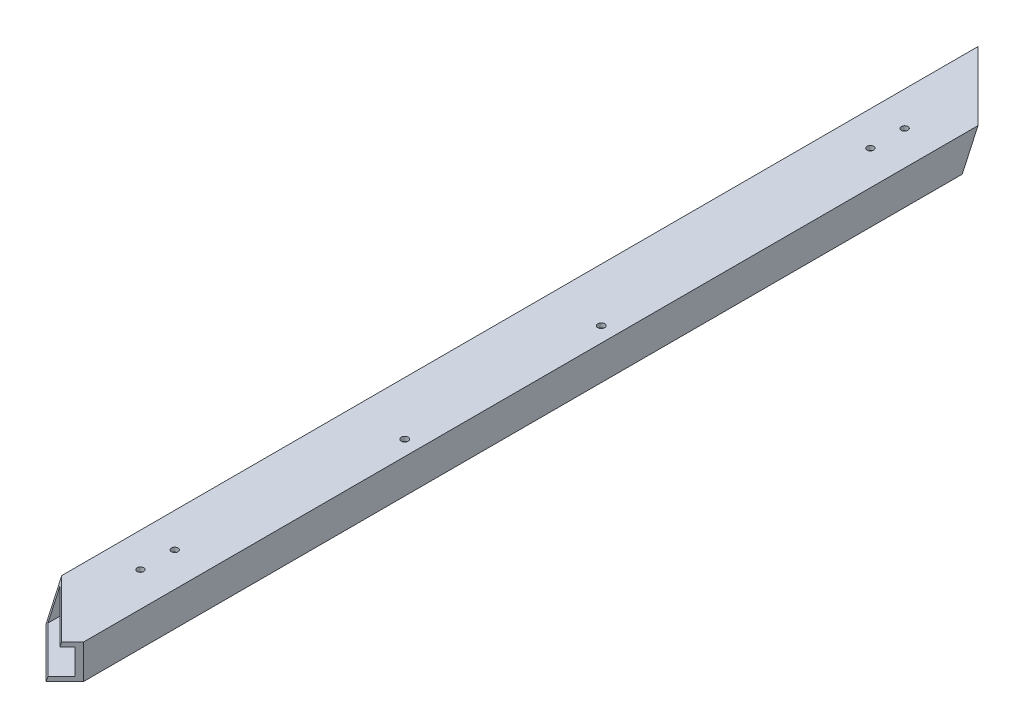
ISO-10303-21;
HEADER;
FILE_DESCRIPTION(('STEP AP214'),'2;1');
FILE_NAME('part.step','',(''),(''),'','','');
FILE_SCHEMA(('AUTOMOTIVE_DESIGN { 1 0 10303 214 1 1 1 1 }'));
ENDSEC;
DATA;
#1=APPLICATION_CONTEXT('core data for automotive mechanical design processes');
#2=APPLICATION_PROTOCOL_DEFINITION('international standard','automotive_design',2000,#1);
#3=PRODUCT_CONTEXT('',#1,'mechanical');
#4=PRODUCT('Part','Part','',(#3));
#5=PRODUCT_RELATED_PRODUCT_CATEGORY('part','',(#4));
#6=PRODUCT_DEFINITION_FORMATION('','',#4);
#7=PRODUCT_DEFINITION_CONTEXT('part definition',#1,'design');
#8=PRODUCT_DEFINITION('design','',#6,#7);
#9=PRODUCT_DEFINITION_SHAPE('','',#8);
#10=(LENGTH_UNIT() NAMED_UNIT(*) SI_UNIT(.MILLI.,.METRE.));
#11=(NAMED_UNIT(*) PLANE_ANGLE_UNIT() SI_UNIT($,.RADIAN.));
#12=(NAMED_UNIT(*) SI_UNIT($,.STERADIAN.) SOLID_ANGLE_UNIT());
#13=UNCERTAINTY_MEASURE_WITH_UNIT(LENGTH_MEASURE(1.E-05),#10,'distance_accuracy_value','');
#14=(GEOMETRIC_REPRESENTATION_CONTEXT(3) GLOBAL_UNCERTAINTY_ASSIGNED_CONTEXT((#13)) GLOBAL_UNIT_ASSIGNED_CONTEXT((#10,
#11,#12)) REPRESENTATION_CONTEXT('',''));
#15=CARTESIAN_POINT('',(0.,0.,0.));
#16=DIRECTION('',(0.,0.,1.));
#17=DIRECTION('',(1.,0.,0.));
#18=AXIS2_PLACEMENT_3D('',#15,#16,#17);
#19=CARTESIAN_POINT('',(25.4,-12.7,771.9314));
#20=DIRECTION('',(-1.,0.,0.));
#21=DIRECTION('',(0.,0.,1.));
#22=AXIS2_PLACEMENT_3D('',#19,#20,#21);
#23=PLANE('',#22);
#24=DIRECTION('',(0.,-0.90866085456603,0.417534970247202));
#25=VECTOR('',#24,1.);
#26=CARTESIAN_POINT('',(25.4,-281.867461744109,186.155469267859));
#27=LINE('',#26,#25);
#28=CARTESIAN_POINT('',(25.3999999999999,12.7,50.7999999999986));
#29=VERTEX_POINT('',#28);
#30=CARTESIAN_POINT('',(25.4,-12.7,62.4714483638043));
#31=VERTEX_POINT('',#30);
#32=EDGE_CURVE('E132',#29,#31,#27,.T.);
#33=ORIENTED_EDGE('',*,*,#32,.F.);
#34=DIRECTION('',(0.,0.,-1.));
#35=VECTOR('',#34,1.);
#36=CARTESIAN_POINT('',(25.4,12.7,771.9314));
#37=LINE('',#36,#35);
#38=CARTESIAN_POINT('',(25.4,12.7,714.375));
#39=VERTEX_POINT('',#38);
#40=EDGE_CURVE('E42',#39,#29,#37,.T.);
#41=ORIENTED_EDGE('',*,*,#40,.F.);
#42=DIRECTION('',(0.,1.,0.));
#43=VECTOR('',#42,1.);
#44=CARTESIAN_POINT('',(25.4,-12.7,714.375));
#45=LINE('',#44,#43);
#46=CARTESIAN_POINT('',(25.4,-12.7,714.375));
#47=VERTEX_POINT('',#46);
#48=EDGE_CURVE('E130',#47,#39,#45,.T.);
#49=ORIENTED_EDGE('',*,*,#48,.F.);
#50=DIRECTION('',(0.,0.,-1.));
#51=VECTOR('',#50,1.);
#52=CARTESIAN_POINT('',(25.4,-12.7,771.9314));
#53=LINE('',#52,#51);
#54=EDGE_CURVE('E159',#47,#31,#53,.T.);
#55=ORIENTED_EDGE('',*,*,#54,.T.);
#56=EDGE_LOOP('',(#33,#41,#49,#55));
#57=FACE_BOUND('',#56,.T.);
#58=ADVANCED_FACE('F34',(#57),#23,.F.);
#59=CARTESIAN_POINT('',(-25.4,-12.7,771.9314));
#60=DIRECTION('',(1.,0.,0.));
#61=DIRECTION('',(0.,0.,-1.));
#62=AXIS2_PLACEMENT_3D('',#59,#60,#61);
#63=PLANE('',#62);
#64=DIRECTION('',(0.,0.,-1.));
#65=VECTOR('',#64,1.);
#66=CARTESIAN_POINT('',(-25.4,-12.7,771.9314));
#67=LINE('',#66,#65);
#68=CARTESIAN_POINT('',(-25.4,-12.7,691.557478073252));
#69=VERTEX_POINT('',#68);
#70=CARTESIAN_POINT('',(-25.4,-12.7,11.6714483638057));
#71=VERTEX_POINT('',#70);
#72=EDGE_CURVE('E162',#69,#71,#67,.T.);
#73=ORIENTED_EDGE('',*,*,#72,.F.);
#74=DIRECTION('',(0.,0.90866085456603,-0.417534970247202));
#75=VECTOR('',#74,1.);
#76=CARTESIAN_POINT('',(-25.4,-43.1936797426668,705.569502031478));
#77=LINE('',#76,#75);
#78=CARTESIAN_POINT('',(-25.4000000000001,12.7,679.886029709446));
#79=VERTEX_POINT('',#78);
#80=EDGE_CURVE('E179',#69,#79,#77,.T.);
#81=ORIENTED_EDGE('',*,*,#80,.T.);
#82=DIRECTION('',(0.,0.,-1.));
#83=VECTOR('',#82,1.);
#84=CARTESIAN_POINT('',(-25.4,12.7,771.9314));
#85=LINE('',#84,#83);
#86=CARTESIAN_POINT('',(-25.4,12.7,0.));
#87=VERTEX_POINT('',#86);
#88=EDGE_CURVE('E126',#79,#87,#85,.T.);
#89=ORIENTED_EDGE('',*,*,#88,.T.);
#90=DIRECTION('',(0.,0.90866085456603,-0.417534970247202));
#91=VECTOR('',#90,1.);
#92=CARTESIAN_POINT('',(-25.4,-301.14086403421,144.211710197931));
#93=LINE('',#92,#91);
#94=EDGE_CURVE('E136',#71,#87,#93,.T.);
#95=ORIENTED_EDGE('',*,*,#94,.F.);
#96=EDGE_LOOP('',(#73,#81,#89,#95));
#97=FACE_BOUND('',#96,.T.);
#98=ADVANCED_FACE('F194',(#97),#63,.F.);
#99=CARTESIAN_POINT('',(-25.4,-12.7,771.9314));
#100=DIRECTION('',(0.,1.,0.));
#101=DIRECTION('',(0.,0.,1.));
#102=AXIS2_PLACEMENT_3D('',#99,#100,#101);
#103=PLANE('',#102);
#104=CARTESIAN_POINT('',(14.2367000000049,-12.7,319.172239036625));
#105=DIRECTION('',(0.,-1.,0.));
#106=DIRECTION('',(0.,0.,-1.));
#107=AXIS2_PLACEMENT_3D('',#104,#105,#106);
#108=CIRCLE('',#107,2.57975099999999);
#109=CARTESIAN_POINT('',(14.2367000000049,-12.7,316.592488036625));
#110=VERTEX_POINT('',#109);
#111=EDGE_CURVE('E327',#110,#110,#108,.T.);
#112=ORIENTED_EDGE('',*,*,#111,.F.);
#113=EDGE_LOOP('',(#112));
#114=FACE_BOUND('',#113,.T.);
#115=CARTESIAN_POINT('',(14.2367000000001,-12.7,464.968239036626));
#116=DIRECTION('',(0.,-1.,0.));
#117=DIRECTION('',(0.,0.,-1.));
#118=AXIS2_PLACEMENT_3D('',#115,#116,#117);
#119=CIRCLE('',#118,2.57975099999999);
#120=CARTESIAN_POINT('',(14.2367000000001,-12.7,462.388488036626));
#121=VERTEX_POINT('',#120);
#122=EDGE_CURVE('E320',#121,#121,#119,.T.);
#123=ORIENTED_EDGE('',*,*,#122,.F.);
#124=EDGE_LOOP('',(#123));
#125=FACE_BOUND('',#124,.T.);
#126=CARTESIAN_POINT('',(-6.24500451351651E-12,-12.7,621.467704493594));
#127=DIRECTION('',(0.,1.,0.));
#128=DIRECTION('',(0.,0.,1.));
#129=AXIS2_PLACEMENT_3D('',#126,#127,#128);
#130=CIRCLE('',#129,2.4638);
#131=CARTESIAN_POINT('',(-6.24500451351651E-12,-12.7,623.931504493594));
#132=VERTEX_POINT('',#131);
#133=EDGE_CURVE('E307',#132,#132,#130,.T.);
#134=ORIENTED_EDGE('',*,*,#133,.T.);
#135=EDGE_LOOP('',(#134));
#136=FACE_BOUND('',#135,.T.);
#137=CARTESIAN_POINT('',(-6.00561267383171E-12,-12.7,646.867704493594));
#138=DIRECTION('',(0.,1.,0.));
#139=DIRECTION('',(0.,0.,1.));
#140=AXIS2_PLACEMENT_3D('',#137,#138,#139);
#141=CIRCLE('',#140,2.4638);
#142=CARTESIAN_POINT('',(-6.00561267383171E-12,-12.7,649.331504493594));
#143=VERTEX_POINT('',#142);
#144=EDGE_CURVE('E297',#143,#143,#141,.T.);
#145=ORIENTED_EDGE('',*,*,#144,.T.);
#146=EDGE_LOOP('',(#145));
#147=FACE_BOUND('',#146,.T.);
#148=CARTESIAN_POINT('',(-1.99840144432528E-12,-12.7,79.8576765553637));
#149=DIRECTION('',(0.,-1.,0.));
#150=DIRECTION('',(0.,0.,-1.));
#151=AXIS2_PLACEMENT_3D('',#148,#149,#150);
#152=CIRCLE('',#151,2.4638);
#153=CARTESIAN_POINT('',(-1.99840144432528E-12,-12.7,77.3938765553637));
#154=VERTEX_POINT('',#153);
#155=EDGE_CURVE('E288',#154,#154,#152,.T.);
#156=ORIENTED_EDGE('',*,*,#155,.F.);
#157=EDGE_LOOP('',(#156));
#158=FACE_BOUND('',#157,.T.);
#159=CARTESIAN_POINT('',(-1.74166236988071E-12,-12.7,105.257676555364));
#160=DIRECTION('',(0.,-1.,0.));
#161=DIRECTION('',(0.,0.,-1.));
#162=AXIS2_PLACEMENT_3D('',#159,#160,#161);
#163=CIRCLE('',#162,2.4638);
#164=CARTESIAN_POINT('',(-1.74166236988071E-12,-12.7,102.793876555364));
#165=VERTEX_POINT('',#164);
#166=EDGE_CURVE('E278',#165,#165,#163,.T.);
#167=ORIENTED_EDGE('',*,*,#166,.F.);
#168=EDGE_LOOP('',(#167));
#169=FACE_BOUND('',#168,.T.);
#170=DIRECTION('',(-0.707106781186544,0.,0.707106781186551));
#171=VECTOR('',#170,1.);
#172=CARTESIAN_POINT('',(-3.37820000000001,-12.7,743.1532));
#173=LINE('',#172,#171);
#174=CARTESIAN_POINT('',(11.4087609633743,-12.7,728.366239036625));
#175=VERTEX_POINT('',#174);
#176=EDGE_CURVE('E131',#47,#175,#173,.T.);
#177=ORIENTED_EDGE('',*,*,#176,.T.);
#178=DIRECTION('',(0.707106781186551,0.,0.707106781186544));
#179=VECTOR('',#178,1.);
#180=CARTESIAN_POINT('',(-534.429166587454,-12.7,182.528311485803));
#181=LINE('',#180,#179);
#182=EDGE_CURVE('E49',#69,#175,#181,.T.);
#183=ORIENTED_EDGE('',*,*,#182,.F.);
#184=ORIENTED_EDGE('',*,*,#72,.T.);
#185=DIRECTION('',(-0.707106781186557,0.,-0.707106781186538));
#186=VECTOR('',#185,1.);
#187=CARTESIAN_POINT('',(365.740875818098,-12.7,402.812324181893));
#188=LINE('',#187,#186);
#189=EDGE_CURVE('E173',#31,#71,#188,.T.);
#190=ORIENTED_EDGE('',*,*,#189,.F.);
#191=ORIENTED_EDGE('',*,*,#54,.F.);
#192=EDGE_LOOP('',(#177,#183,#184,#190,#191));
#193=FACE_BOUND('',#192,.T.);
#194=ADVANCED_FACE('F176',(#114,#125,#136,#147,#158,#169,#193),#103,.F.);
#195=CARTESIAN_POINT('',(-22.225,-9.525,771.9314));
#196=DIRECTION('',(1.,0.,0.));
#197=DIRECTION('',(0.,0.,-1.));
#198=AXIS2_PLACEMENT_3D('',#195,#196,#197);
#199=PLANE('',#198);
#200=DIRECTION('',(0.,0.90866085456603,-0.417534970247202));
#201=VECTOR('',#200,1.);
#202=CARTESIAN_POINT('',(-22.225,-39.3676071576649,706.986399330218));
#203=LINE('',#202,#201);
#204=CARTESIAN_POINT('',(-22.225,-9.525,693.273547027776));
#205=VERTEX_POINT('',#204);
#206=CARTESIAN_POINT('',(-22.225,9.525,684.519960754921));
#207=VERTEX_POINT('',#206);
#208=EDGE_CURVE('E201',#205,#207,#203,.T.);
#209=ORIENTED_EDGE('',*,*,#208,.F.);
#210=DIRECTION('',(0.,0.,-1.));
#211=VECTOR('',#210,1.);
#212=CARTESIAN_POINT('',(-22.225,-9.525,771.9314));
#213=LINE('',#212,#211);
#214=CARTESIAN_POINT('',(-22.2250000000001,-9.525,13.3875173183298));
#215=VERTEX_POINT('',#214);
#216=EDGE_CURVE('E157',#205,#215,#213,.T.);
#217=ORIENTED_EDGE('',*,*,#216,.T.);
#218=DIRECTION('',(0.,0.90866085456603,-0.417534970247202));
#219=VECTOR('',#218,1.);
#220=CARTESIAN_POINT('',(-22.225,-297.314791449209,145.62860749667));
#221=LINE('',#220,#219);
#222=CARTESIAN_POINT('',(-22.2250000000001,9.525,4.63393104547549));
#223=VERTEX_POINT('',#222);
#224=EDGE_CURVE('E190',#215,#223,#221,.T.);
#225=ORIENTED_EDGE('',*,*,#224,.T.);
#226=DIRECTION('',(0.,0.,-1.));
#227=VECTOR('',#226,1.);
#228=CARTESIAN_POINT('',(-22.225,9.525,771.9314));
#229=LINE('',#228,#227);
#230=EDGE_CURVE('E149',#207,#223,#229,.T.);
#231=ORIENTED_EDGE('',*,*,#230,.F.);
#232=EDGE_LOOP('',(#209,#217,#225,#231));
#233=FACE_BOUND('',#232,.T.);
#234=ADVANCED_FACE('F209',(#233),#199,.T.);
#235=CARTESIAN_POINT('',(-22.225,-9.525,771.9314));
#236=DIRECTION('',(0.,1.,0.));
#237=DIRECTION('',(0.,0.,1.));
#238=AXIS2_PLACEMENT_3D('',#235,#236,#237);
#239=PLANE('',#238);
#240=CARTESIAN_POINT('',(14.2367000000049,-9.525,319.172239036625));
#241=DIRECTION('',(0.,1.,0.));
#242=DIRECTION('',(0.,0.,1.));
#243=AXIS2_PLACEMENT_3D('',#240,#241,#242);
#244=CIRCLE('',#243,2.57975099999999);
#245=CARTESIAN_POINT('',(14.2367000000049,-9.525,321.751990036625));
#246=VERTEX_POINT('',#245);
#247=EDGE_CURVE('E252',#246,#246,#244,.T.);
#248=ORIENTED_EDGE('',*,*,#247,.F.);
#249=EDGE_LOOP('',(#248));
#250=FACE_BOUND('',#249,.T.);
#251=CARTESIAN_POINT('',(14.2367000000001,-9.525,464.968239036626));
#252=DIRECTION('',(0.,1.,0.));
#253=DIRECTION('',(0.,0.,1.));
#254=AXIS2_PLACEMENT_3D('',#251,#252,#253);
#255=CIRCLE('',#254,2.57975099999999);
#256=CARTESIAN_POINT('',(14.2367000000001,-9.525,467.547990036625));
#257=VERTEX_POINT('',#256);
#258=EDGE_CURVE('E256',#257,#257,#255,.T.);
#259=ORIENTED_EDGE('',*,*,#258,.F.);
#260=EDGE_LOOP('',(#259));
#261=FACE_BOUND('',#260,.T.);
#262=CARTESIAN_POINT('',(-6.24500451351651E-12,-9.525,621.467704493594));
#263=DIRECTION('',(0.,1.,0.));
#264=DIRECTION('',(0.,0.,1.));
#265=AXIS2_PLACEMENT_3D('',#262,#263,#264);
#266=CIRCLE('',#265,2.4638);
#267=CARTESIAN_POINT('',(-6.24500451351651E-12,-9.525,623.931504493594));
#268=VERTEX_POINT('',#267);
#269=EDGE_CURVE('E260',#268,#268,#266,.T.);
#270=ORIENTED_EDGE('',*,*,#269,.F.);
#271=EDGE_LOOP('',(#270));
#272=FACE_BOUND('',#271,.T.);
#273=CARTESIAN_POINT('',(-6.00561267383171E-12,-9.525,646.867704493594));
#274=DIRECTION('',(0.,1.,0.));
#275=DIRECTION('',(0.,0.,1.));
#276=AXIS2_PLACEMENT_3D('',#273,#274,#275);
#277=CIRCLE('',#276,2.4638);
#278=CARTESIAN_POINT('',(-6.00561267383171E-12,-9.525,649.331504493594));
#279=VERTEX_POINT('',#278);
#280=EDGE_CURVE('E264',#279,#279,#277,.T.);
#281=ORIENTED_EDGE('',*,*,#280,.F.);
#282=EDGE_LOOP('',(#281));
#283=FACE_BOUND('',#282,.T.);
#284=CARTESIAN_POINT('',(-1.99840144432528E-12,-9.525,79.8576765553637));
#285=DIRECTION('',(0.,1.,0.));
#286=DIRECTION('',(0.,0.,1.));
#287=AXIS2_PLACEMENT_3D('',#284,#285,#286);
#288=CIRCLE('',#287,2.4638);
#289=CARTESIAN_POINT('',(-1.99840144432528E-12,-9.525,82.3214765553637));
#290=VERTEX_POINT('',#289);
#291=EDGE_CURVE('E268',#290,#290,#288,.T.);
#292=ORIENTED_EDGE('',*,*,#291,.F.);
#293=EDGE_LOOP('',(#292));
#294=FACE_BOUND('',#293,.T.);
#295=CARTESIAN_POINT('',(-1.74166236988071E-12,-9.525,105.257676555364));
#296=DIRECTION('',(0.,1.,0.));
#297=DIRECTION('',(0.,0.,1.));
#298=AXIS2_PLACEMENT_3D('',#295,#296,#297);
#299=CIRCLE('',#298,2.4638);
#300=CARTESIAN_POINT('',(-1.74166236988071E-12,-9.525,107.721476555364));
#301=VERTEX_POINT('',#300);
#302=EDGE_CURVE('E197',#301,#301,#299,.T.);
#303=ORIENTED_EDGE('',*,*,#302,.F.);
#304=EDGE_LOOP('',(#303));
#305=FACE_BOUND('',#304,.T.);
#306=DIRECTION('',(-0.707106781186551,0.,-0.707106781186544));
#307=VECTOR('',#306,1.);
#308=CARTESIAN_POINT('',(17.1039264861121,-9.525,732.602473513887));
#309=LINE('',#308,#307);
#310=CARTESIAN_POINT('',(12.1382264861122,-9.52499999999998,727.636773513888));
#311=VERTEX_POINT('',#310);
#312=EDGE_CURVE('E182',#311,#205,#309,.T.);
#313=ORIENTED_EDGE('',*,*,#312,.F.);
#314=DIRECTION('',(-0.707106781186544,0.,0.707106781186551));
#315=VECTOR('',#314,1.);
#316=CARTESIAN_POINT('',(-27.1906999999999,-9.525,766.9657));
#317=LINE('',#316,#315);
#318=CARTESIAN_POINT('',(22.225,-9.525,717.55));
#319=VERTEX_POINT('',#318);
#320=EDGE_CURVE('E144',#319,#311,#317,.T.);
#321=ORIENTED_EDGE('',*,*,#320,.F.);
#322=DIRECTION('',(0.,0.,-1.));
#323=VECTOR('',#322,1.);
#324=CARTESIAN_POINT('',(22.225,-9.525,771.9314));
#325=LINE('',#324,#323);
#326=CARTESIAN_POINT('',(22.225,-9.52499999999995,57.8375173183287));
#327=VERTEX_POINT('',#326);
#328=EDGE_CURVE('E154',#319,#327,#325,.T.);
#329=ORIENTED_EDGE('',*,*,#328,.T.);
#330=DIRECTION('',(-0.707106781186557,0.,-0.707106781186538));
#331=VECTOR('',#330,1.);
#332=CARTESIAN_POINT('',(357.046941340835,-9.525,392.659458659155));
#333=LINE('',#332,#331);
#334=EDGE_CURVE('E187',#327,#215,#333,.T.);
#335=ORIENTED_EDGE('',*,*,#334,.T.);
#336=ORIENTED_EDGE('',*,*,#216,.F.);
#337=EDGE_LOOP('',(#313,#321,#329,#335,#336));
#338=FACE_BOUND('',#337,.T.);
#339=ADVANCED_FACE('F211',(#250,#261,#272,#283,#294,#305,#338),#239,.T.);
#340=CARTESIAN_POINT('',(22.225,-9.525,771.9314));
#341=DIRECTION('',(-1.,0.,0.));
#342=DIRECTION('',(0.,-1.,0.));
#343=AXIS2_PLACEMENT_3D('',#340,#341,#342);
#344=PLANE('',#343);
#345=DIRECTION('',(0.,0.,-1.));
#346=VECTOR('',#345,1.);
#347=CARTESIAN_POINT('',(22.225,9.525,771.9314));
#348=LINE('',#347,#346);
#349=CARTESIAN_POINT('',(22.225,9.525,717.55));
#350=VERTEX_POINT('',#349);
#351=CARTESIAN_POINT('',(22.225,9.525,49.0839310454743));
#352=VERTEX_POINT('',#351);
#353=EDGE_CURVE('E151',#350,#352,#348,.T.);
#354=ORIENTED_EDGE('',*,*,#353,.T.);
#355=DIRECTION('',(0.,-0.90866085456603,0.417534970247202));
#356=VECTOR('',#355,1.);
#357=CARTESIAN_POINT('',(22.225,-280.45056444537,182.329396682858));
#358=LINE('',#357,#356);
#359=EDGE_CURVE('E57',#352,#327,#358,.T.);
#360=ORIENTED_EDGE('',*,*,#359,.T.);
#361=ORIENTED_EDGE('',*,*,#328,.F.);
#362=DIRECTION('',(0.,-1.,0.));
#363=VECTOR('',#362,1.);
#364=CARTESIAN_POINT('',(22.225,-9.52499999999999,717.55));
#365=LINE('',#364,#363);
#366=EDGE_CURVE('E142',#350,#319,#365,.T.);
#367=ORIENTED_EDGE('',*,*,#366,.F.);
#368=EDGE_LOOP('',(#354,#360,#361,#367));
#369=FACE_BOUND('',#368,.T.);
#370=ADVANCED_FACE('F214',(#369),#344,.T.);
#371=CARTESIAN_POINT('',(-22.225,9.525,771.9314));
#372=DIRECTION('',(0.,-1.,0.));
#373=DIRECTION('',(0.,0.,-1.));
#374=AXIS2_PLACEMENT_3D('',#371,#372,#373);
#375=PLANE('',#374);
#376=CARTESIAN_POINT('',(14.2367000000049,9.525,319.172239036625));
#377=DIRECTION('',(0.,-1.,0.));
#378=DIRECTION('',(0.,0.,-1.));
#379=AXIS2_PLACEMENT_3D('',#376,#377,#378);
#380=CIRCLE('',#379,2.57975099999999);
#381=CARTESIAN_POINT('',(14.2367000000049,9.525,316.592488036625));
#382=VERTEX_POINT('',#381);
#383=EDGE_CURVE('E37',#382,#382,#380,.T.);
#384=ORIENTED_EDGE('',*,*,#383,.F.);
#385=EDGE_LOOP('',(#384));
#386=FACE_BOUND('',#385,.T.);
#387=CARTESIAN_POINT('',(14.2367000000001,9.525,464.968239036626));
#388=DIRECTION('',(0.,-1.,0.));
#389=DIRECTION('',(0.,0.,-1.));
#390=AXIS2_PLACEMENT_3D('',#387,#388,#389);
#391=CIRCLE('',#390,2.57975099999999);
#392=CARTESIAN_POINT('',(14.2367000000001,9.525,462.388488036626));
#393=VERTEX_POINT('',#392);
#394=EDGE_CURVE('E314',#393,#393,#391,.T.);
#395=ORIENTED_EDGE('',*,*,#394,.F.);
#396=EDGE_LOOP('',(#395));
#397=FACE_BOUND('',#396,.T.);
#398=CARTESIAN_POINT('',(-6.24500451351651E-12,9.525,621.467704493594));
#399=DIRECTION('',(0.,-1.,0.));
#400=DIRECTION('',(0.,0.,-1.));
#401=AXIS2_PLACEMENT_3D('',#398,#399,#400);
#402=CIRCLE('',#401,2.4638);
#403=CARTESIAN_POINT('',(-6.24500451351651E-12,9.525,619.003904493594));
#404=VERTEX_POINT('',#403);
#405=EDGE_CURVE('E304',#404,#404,#402,.T.);
#406=ORIENTED_EDGE('',*,*,#405,.F.);
#407=EDGE_LOOP('',(#406));
#408=FACE_BOUND('',#407,.T.);
#409=CARTESIAN_POINT('',(-6.00561267383171E-12,9.525,646.867704493594));
#410=DIRECTION('',(0.,-1.,0.));
#411=DIRECTION('',(0.,0.,-1.));
#412=AXIS2_PLACEMENT_3D('',#409,#410,#411);
#413=CIRCLE('',#412,2.4638);
#414=CARTESIAN_POINT('',(-6.00561267383171E-12,9.525,644.403904493594));
#415=VERTEX_POINT('',#414);
#416=EDGE_CURVE('E294',#415,#415,#413,.T.);
#417=ORIENTED_EDGE('',*,*,#416,.F.);
#418=EDGE_LOOP('',(#417));
#419=FACE_BOUND('',#418,.T.);
#420=CARTESIAN_POINT('',(-1.99840144432528E-12,9.525,79.8576765553637));
#421=DIRECTION('',(0.,-1.,0.));
#422=DIRECTION('',(0.,0.,-1.));
#423=AXIS2_PLACEMENT_3D('',#420,#421,#422);
#424=CIRCLE('',#423,2.4638);
#425=CARTESIAN_POINT('',(-1.99840144432528E-12,9.525,77.3938765553637));
#426=VERTEX_POINT('',#425);
#427=EDGE_CURVE('E284',#426,#426,#424,.T.);
#428=ORIENTED_EDGE('',*,*,#427,.F.);
#429=EDGE_LOOP('',(#428));
#430=FACE_BOUND('',#429,.T.);
#431=CARTESIAN_POINT('',(-1.74166236988071E-12,9.525,105.257676555364));
#432=DIRECTION('',(0.,-1.,0.));
#433=DIRECTION('',(0.,0.,-1.));
#434=AXIS2_PLACEMENT_3D('',#431,#432,#433);
#435=CIRCLE('',#434,2.4638);
#436=CARTESIAN_POINT('',(-1.74166236988071E-12,9.525,102.793876555364));
#437=VERTEX_POINT('',#436);
#438=EDGE_CURVE('E272',#437,#437,#435,.T.);
#439=ORIENTED_EDGE('',*,*,#438,.F.);
#440=EDGE_LOOP('',(#439));
#441=FACE_BOUND('',#440,.T.);
#442=DIRECTION('',(0.707106781186551,0.,0.707106781186544));
#443=VECTOR('',#442,1.);
#444=CARTESIAN_POINT('',(21.4807196225392,9.525,728.22568037746));
#445=LINE('',#444,#443);
#446=CARTESIAN_POINT('',(16.5150196225393,9.52500000000001,723.25998037746));
#447=VERTEX_POINT('',#446);
#448=EDGE_CURVE('E114',#207,#447,#445,.T.);
#449=ORIENTED_EDGE('',*,*,#448,.F.);
#450=ORIENTED_EDGE('',*,*,#230,.T.);
#451=DIRECTION('',(0.707106781186557,0.,0.707106781186538));
#452=VECTOR('',#451,1.);
#453=CARTESIAN_POINT('',(361.423734477262,9.525,388.282665522727));
#454=LINE('',#453,#452);
#455=EDGE_CURVE('E178',#223,#352,#454,.T.);
#456=ORIENTED_EDGE('',*,*,#455,.T.);
#457=ORIENTED_EDGE('',*,*,#353,.F.);
#458=DIRECTION('',(0.707106781186544,0.,-0.707106781186551));
#459=VECTOR('',#458,1.);
#460=CARTESIAN_POINT('',(-27.1906999999999,9.525,766.9657));
#461=LINE('',#460,#459);
#462=EDGE_CURVE('E140',#447,#350,#461,.T.);
#463=ORIENTED_EDGE('',*,*,#462,.F.);
#464=EDGE_LOOP('',(#449,#450,#456,#457,#463));
#465=FACE_BOUND('',#464,.T.);
#466=ADVANCED_FACE('F218',(#386,#397,#408,#419,#430,#441,#465),#375,.T.);
#467=CARTESIAN_POINT('',(-25.4,12.7,771.9314));
#468=DIRECTION('',(0.,-1.,0.));
#469=DIRECTION('',(0.,0.,-1.));
#470=AXIS2_PLACEMENT_3D('',#467,#468,#469);
#471=PLANE('',#470);
#472=CARTESIAN_POINT('',(14.2367000000049,12.7,319.172239036625));
#473=DIRECTION('',(0.,-1.,0.));
#474=DIRECTION('',(0.,0.,-1.));
#475=AXIS2_PLACEMENT_3D('',#472,#473,#474);
#476=CIRCLE('',#475,2.57975099999998);
#477=CARTESIAN_POINT('',(14.2367000000049,12.7,316.592488036625));
#478=VERTEX_POINT('',#477);
#479=EDGE_CURVE('E324',#478,#478,#476,.T.);
#480=ORIENTED_EDGE('',*,*,#479,.T.);
#481=EDGE_LOOP('',(#480));
#482=FACE_BOUND('',#481,.T.);
#483=CARTESIAN_POINT('',(14.2367000000001,12.7,464.968239036626));
#484=DIRECTION('',(0.,-1.,0.));
#485=DIRECTION('',(0.,0.,-1.));
#486=AXIS2_PLACEMENT_3D('',#483,#484,#485);
#487=CIRCLE('',#486,2.57975099999998);
#488=CARTESIAN_POINT('',(14.2367000000001,12.7,462.388488036626));
#489=VERTEX_POINT('',#488);
#490=EDGE_CURVE('E317',#489,#489,#487,.T.);
#491=ORIENTED_EDGE('',*,*,#490,.T.);
#492=EDGE_LOOP('',(#491));
#493=FACE_BOUND('',#492,.T.);
#494=CARTESIAN_POINT('',(-6.24500451351651E-12,12.7,621.467704493594));
#495=DIRECTION('',(0.,1.,0.));
#496=DIRECTION('',(0.,0.,1.));
#497=AXIS2_PLACEMENT_3D('',#494,#495,#496);
#498=CIRCLE('',#497,2.4638);
#499=CARTESIAN_POINT('',(-6.24500451351651E-12,12.7,623.931504493594));
#500=VERTEX_POINT('',#499);
#501=EDGE_CURVE('E308',#500,#500,#498,.T.);
#502=ORIENTED_EDGE('',*,*,#501,.F.);
#503=EDGE_LOOP('',(#502));
#504=FACE_BOUND('',#503,.T.);
#505=CARTESIAN_POINT('',(-6.00561267383171E-12,12.7,646.867704493594));
#506=DIRECTION('',(0.,1.,0.));
#507=DIRECTION('',(0.,0.,1.));
#508=AXIS2_PLACEMENT_3D('',#505,#506,#507);
#509=CIRCLE('',#508,2.4638);
#510=CARTESIAN_POINT('',(-6.00561267383171E-12,12.7,649.331504493594));
#511=VERTEX_POINT('',#510);
#512=EDGE_CURVE('E298',#511,#511,#509,.T.);
#513=ORIENTED_EDGE('',*,*,#512,.F.);
#514=EDGE_LOOP('',(#513));
#515=FACE_BOUND('',#514,.T.);
#516=CARTESIAN_POINT('',(-1.99840144432528E-12,12.7,79.8576765553637));
#517=DIRECTION('',(0.,-1.,0.));
#518=DIRECTION('',(0.,0.,-1.));
#519=AXIS2_PLACEMENT_3D('',#516,#517,#518);
#520=CIRCLE('',#519,2.4638);
#521=CARTESIAN_POINT('',(-1.99840144432528E-12,12.7,77.3938765553637));
#522=VERTEX_POINT('',#521);
#523=EDGE_CURVE('E287',#522,#522,#520,.T.);
#524=ORIENTED_EDGE('',*,*,#523,.T.);
#525=EDGE_LOOP('',(#524));
#526=FACE_BOUND('',#525,.T.);
#527=CARTESIAN_POINT('',(-1.74166236988071E-12,12.7,105.257676555364));
#528=DIRECTION('',(0.,-1.,0.));
#529=DIRECTION('',(0.,0.,-1.));
#530=AXIS2_PLACEMENT_3D('',#527,#528,#529);
#531=CIRCLE('',#530,2.4638);
#532=CARTESIAN_POINT('',(-1.74166236988071E-12,12.7,102.793876555364));
#533=VERTEX_POINT('',#532);
#534=EDGE_CURVE('E275',#533,#533,#531,.T.);
#535=ORIENTED_EDGE('',*,*,#534,.T.);
#536=EDGE_LOOP('',(#535));
#537=FACE_BOUND('',#536,.T.);
#538=ORIENTED_EDGE('',*,*,#88,.F.);
#539=DIRECTION('',(0.707106781186551,0.,0.707106781186544));
#540=VECTOR('',#539,1.);
#541=CARTESIAN_POINT('',(-528.593442405551,12.7,176.6925873039));
#542=LINE('',#541,#540);
#543=CARTESIAN_POINT('',(17.2444851452771,12.7,722.530514854723));
#544=VERTEX_POINT('',#543);
#545=EDGE_CURVE('E111',#79,#544,#542,.T.);
#546=ORIENTED_EDGE('',*,*,#545,.T.);
#547=DIRECTION('',(-0.707106781186544,0.,0.707106781186551));
#548=VECTOR('',#547,1.);
#549=CARTESIAN_POINT('',(-3.37820000000001,12.7,743.1532));
#550=LINE('',#549,#548);
#551=EDGE_CURVE('E123',#39,#544,#550,.T.);
#552=ORIENTED_EDGE('',*,*,#551,.F.);
#553=ORIENTED_EDGE('',*,*,#40,.T.);
#554=DIRECTION('',(0.707106781186557,0.,0.707106781186538));
#555=VECTOR('',#554,1.);
#556=CARTESIAN_POINT('',(-25.4,12.7,0.));
#557=LINE('',#556,#555);
#558=EDGE_CURVE('E147',#87,#29,#557,.T.);
#559=ORIENTED_EDGE('',*,*,#558,.F.);
#560=EDGE_LOOP('',(#538,#546,#552,#553,#559));
#561=FACE_BOUND('',#560,.T.);
#562=ADVANCED_FACE('F121',(#482,#493,#504,#515,#526,#537,#561),#471,.F.);
#563=CARTESIAN_POINT('',(-3.37820000000001,-12.7,743.1532));
#564=DIRECTION('',(-0.707106781186551,0.,-0.707106781186544));
#565=DIRECTION('',(-0.707106781186544,0.,0.707106781186551));
#566=AXIS2_PLACEMENT_3D('',#563,#564,#565);
#567=PLANE('',#566);
#568=ORIENTED_EDGE('',*,*,#551,.T.);
#569=DIRECTION('',(-0.218508012224405,-0.951056516295155,0.218508012224408));
#570=VECTOR('',#569,1.);
#571=CARTESIAN_POINT('',(9.99673183895158,-18.845859304242,729.778268161048));
#572=LINE('',#571,#570);
#573=EDGE_CURVE('E11',#544,#447,#572,.T.);
#574=ORIENTED_EDGE('',*,*,#573,.T.);
#575=ORIENTED_EDGE('',*,*,#462,.T.);
#576=ORIENTED_EDGE('',*,*,#366,.T.);
#577=ORIENTED_EDGE('',*,*,#320,.T.);
#578=DIRECTION('',(0.218508012224405,0.951056516295155,-0.218508012224409));
#579=VECTOR('',#578,1.);
#580=CARTESIAN_POINT('',(11.4087609633743,-12.7,728.366239036625));
#581=LINE('',#580,#579);
#582=EDGE_CURVE('E195',#175,#311,#581,.T.);
#583=ORIENTED_EDGE('',*,*,#582,.F.);
#584=ORIENTED_EDGE('',*,*,#176,.F.);
#585=ORIENTED_EDGE('',*,*,#48,.T.);
#586=EDGE_LOOP('',(#568,#574,#575,#576,#577,#583,#584,#585));
#587=FACE_BOUND('',#586,.T.);
#588=ADVANCED_FACE('F128',(#587),#567,.F.);
#589=CARTESIAN_POINT('',(371.576600000001,12.7,396.97659999999));
#590=DIRECTION('',(0.672498511963949,-0.309016994374944,-0.672498511963967));
#591=DIRECTION('',(-0.707106781186557,0.,-0.707106781186538));
#592=AXIS2_PLACEMENT_3D('',#589,#590,#591);
#593=PLANE('',#592);
#594=ORIENTED_EDGE('',*,*,#334,.F.);
#595=ORIENTED_EDGE('',*,*,#359,.F.);
#596=ORIENTED_EDGE('',*,*,#455,.F.);
#597=ORIENTED_EDGE('',*,*,#224,.F.);
#598=EDGE_LOOP('',(#594,#595,#596,#597));
#599=FACE_BOUND('',#598,.T.);
#600=ORIENTED_EDGE('',*,*,#32,.T.);
#601=ORIENTED_EDGE('',*,*,#189,.T.);
#602=ORIENTED_EDGE('',*,*,#94,.T.);
#603=ORIENTED_EDGE('',*,*,#558,.T.);
#604=EDGE_LOOP('',(#600,#601,#602,#603));
#605=FACE_BOUND('',#604,.T.);
#606=ADVANCED_FACE('F171',(#599,#605),#593,.T.);
#607=CARTESIAN_POINT('',(-534.429166587454,-12.7,182.528311485803));
#608=DIRECTION('',(0.672498511963955,-0.309016994374942,-0.672498511963962));
#609=DIRECTION('',(-0.707106781186551,0.,-0.707106781186544));
#610=AXIS2_PLACEMENT_3D('',#607,#608,#609);
#611=PLANE('',#610);
#612=ORIENTED_EDGE('',*,*,#182,.T.);
#613=ORIENTED_EDGE('',*,*,#582,.T.);
#614=ORIENTED_EDGE('',*,*,#312,.T.);
#615=ORIENTED_EDGE('',*,*,#208,.T.);
#616=ORIENTED_EDGE('',*,*,#448,.T.);
#617=ORIENTED_EDGE('',*,*,#573,.F.);
#618=ORIENTED_EDGE('',*,*,#545,.F.);
#619=ORIENTED_EDGE('',*,*,#80,.F.);
#620=EDGE_LOOP('',(#612,#613,#614,#615,#616,#617,#618,#619));
#621=FACE_BOUND('',#620,.T.);
#622=ADVANCED_FACE('F110',(#621),#611,.F.);
#623=CARTESIAN_POINT('',(-1.74166236988071E-12,12.7,105.257676555364));
#624=DIRECTION('',(0.,-1.,0.));
#625=DIRECTION('',(0.,0.,-1.));
#626=AXIS2_PLACEMENT_3D('',#623,#624,#625);
#627=CYLINDRICAL_SURFACE('',#626,2.4638);
#628=ORIENTED_EDGE('',*,*,#438,.T.);
#629=EDGE_LOOP('',(#628));
#630=FACE_BOUND('',#629,.T.);
#631=ORIENTED_EDGE('',*,*,#534,.F.);
#632=EDGE_LOOP('',(#631));
#633=FACE_BOUND('',#632,.T.);
#634=ADVANCED_FACE('F346',(#630,#633),#627,.F.);
#635=ORIENTED_EDGE('',*,*,#302,.T.);
#636=EDGE_LOOP('',(#635));
#637=FACE_BOUND('',#636,.T.);
#638=ORIENTED_EDGE('',*,*,#166,.T.);
#639=EDGE_LOOP('',(#638));
#640=FACE_BOUND('',#639,.T.);
#641=ADVANCED_FACE('F343',(#637,#640),#627,.F.);
#642=CARTESIAN_POINT('',(-1.99840144432528E-12,12.7,79.8576765553637));
#643=DIRECTION('',(0.,-1.,0.));
#644=DIRECTION('',(0.,0.,-1.));
#645=AXIS2_PLACEMENT_3D('',#642,#643,#644);
#646=CYLINDRICAL_SURFACE('',#645,2.4638);
#647=ORIENTED_EDGE('',*,*,#427,.T.);
#648=EDGE_LOOP('',(#647));
#649=FACE_BOUND('',#648,.T.);
#650=ORIENTED_EDGE('',*,*,#523,.F.);
#651=EDGE_LOOP('',(#650));
#652=FACE_BOUND('',#651,.T.);
#653=ADVANCED_FACE('F345',(#649,#652),#646,.F.);
#654=ORIENTED_EDGE('',*,*,#291,.T.);
#655=EDGE_LOOP('',(#654));
#656=FACE_BOUND('',#655,.T.);
#657=ORIENTED_EDGE('',*,*,#155,.T.);
#658=EDGE_LOOP('',(#657));
#659=FACE_BOUND('',#658,.T.);
#660=ADVANCED_FACE('F352',(#656,#659),#646,.F.);
#661=CARTESIAN_POINT('',(-6.00561267383171E-12,-12.7,646.867704493594));
#662=DIRECTION('',(0.,1.,0.));
#663=DIRECTION('',(0.,0.,1.));
#664=AXIS2_PLACEMENT_3D('',#661,#662,#663);
#665=CYLINDRICAL_SURFACE('',#664,2.4638);
#666=ORIENTED_EDGE('',*,*,#416,.T.);
#667=EDGE_LOOP('',(#666));
#668=FACE_BOUND('',#667,.T.);
#669=ORIENTED_EDGE('',*,*,#512,.T.);
#670=EDGE_LOOP('',(#669));
#671=FACE_BOUND('',#670,.T.);
#672=ADVANCED_FACE('F400',(#668,#671),#665,.F.);
#673=ORIENTED_EDGE('',*,*,#280,.T.);
#674=EDGE_LOOP('',(#673));
#675=FACE_BOUND('',#674,.T.);
#676=ORIENTED_EDGE('',*,*,#144,.F.);
#677=EDGE_LOOP('',(#676));
#678=FACE_BOUND('',#677,.T.);
#679=ADVANCED_FACE('F409',(#675,#678),#665,.F.);
#680=CARTESIAN_POINT('',(-6.24500451351651E-12,-12.7,621.467704493594));
#681=DIRECTION('',(0.,1.,0.));
#682=DIRECTION('',(0.,0.,1.));
#683=AXIS2_PLACEMENT_3D('',#680,#681,#682);
#684=CYLINDRICAL_SURFACE('',#683,2.4638);
#685=ORIENTED_EDGE('',*,*,#405,.T.);
#686=EDGE_LOOP('',(#685));
#687=FACE_BOUND('',#686,.T.);
#688=ORIENTED_EDGE('',*,*,#501,.T.);
#689=EDGE_LOOP('',(#688));
#690=FACE_BOUND('',#689,.T.);
#691=ADVANCED_FACE('F418',(#687,#690),#684,.F.);
#692=ORIENTED_EDGE('',*,*,#269,.T.);
#693=EDGE_LOOP('',(#692));
#694=FACE_BOUND('',#693,.T.);
#695=ORIENTED_EDGE('',*,*,#133,.F.);
#696=EDGE_LOOP('',(#695));
#697=FACE_BOUND('',#696,.T.);
#698=ADVANCED_FACE('F427',(#694,#697),#684,.F.);
#699=CARTESIAN_POINT('',(14.2367000000001,-12.7,464.968239036626));
#700=DIRECTION('',(0.,-1.,0.));
#701=DIRECTION('',(0.,0.,-1.));
#702=AXIS2_PLACEMENT_3D('',#699,#700,#701);
#703=CYLINDRICAL_SURFACE('',#702,2.57975099999999);
#704=ORIENTED_EDGE('',*,*,#394,.T.);
#705=EDGE_LOOP('',(#704));
#706=FACE_BOUND('',#705,.T.);
#707=ORIENTED_EDGE('',*,*,#490,.F.);
#708=EDGE_LOOP('',(#707));
#709=FACE_BOUND('',#708,.T.);
#710=ADVANCED_FACE('F436',(#706,#709),#703,.F.);
#711=ORIENTED_EDGE('',*,*,#258,.T.);
#712=EDGE_LOOP('',(#711));
#713=FACE_BOUND('',#712,.T.);
#714=ORIENTED_EDGE('',*,*,#122,.T.);
#715=EDGE_LOOP('',(#714));
#716=FACE_BOUND('',#715,.T.);
#717=ADVANCED_FACE('F485',(#713,#716),#703,.F.);
#718=CARTESIAN_POINT('',(14.2367000000049,-12.7,319.172239036625));
#719=DIRECTION('',(0.,-1.,0.));
#720=DIRECTION('',(0.,0.,-1.));
#721=AXIS2_PLACEMENT_3D('',#718,#719,#720);
#722=CYLINDRICAL_SURFACE('',#721,2.57975099999999);
#723=ORIENTED_EDGE('',*,*,#383,.T.);
#724=EDGE_LOOP('',(#723));
#725=FACE_BOUND('',#724,.T.);
#726=ORIENTED_EDGE('',*,*,#479,.F.);
#727=EDGE_LOOP('',(#726));
#728=FACE_BOUND('',#727,.T.);
#729=ADVANCED_FACE('F492',(#725,#728),#722,.F.);
#730=ORIENTED_EDGE('',*,*,#247,.T.);
#731=EDGE_LOOP('',(#730));
#732=FACE_BOUND('',#731,.T.);
#733=ORIENTED_EDGE('',*,*,#111,.T.);
#734=EDGE_LOOP('',(#733));
#735=FACE_BOUND('',#734,.T.);
#736=ADVANCED_FACE('F331',(#732,#735),#722,.F.);
#737=CLOSED_SHELL('',(#58,#98,#194,#234,#339,#370,#466,#562,#588,#606,#622,#634,#641,#653,#660,
#672,#679,#691,#698,#710,#717,#729,#736));
#738=MANIFOLD_SOLID_BREP('B2',#737);
#739=ADVANCED_BREP_SHAPE_REPRESENTATION('',(#18,#738),#14);
#740=SHAPE_DEFINITION_REPRESENTATION(#9,#739);
ENDSEC;
END-ISO-10303-21;
